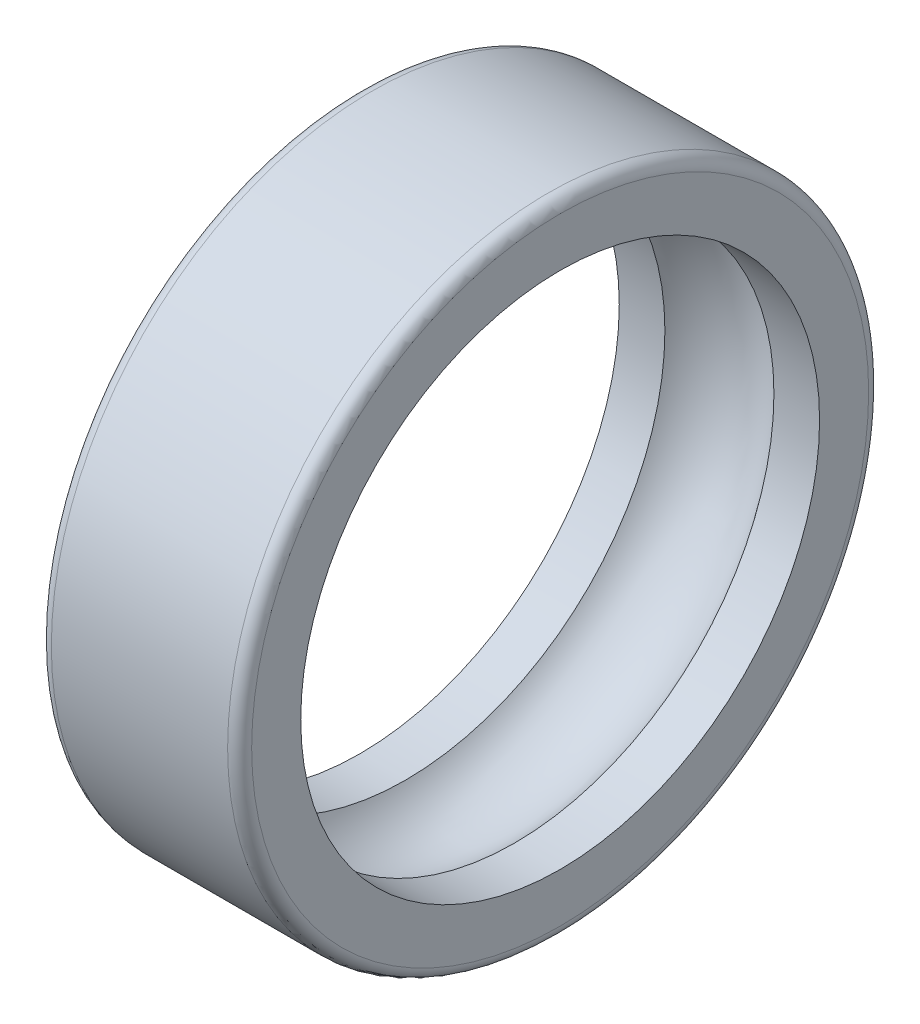
ISO-10303-21;
HEADER;
FILE_DESCRIPTION(('STEP AP214'),'2;1');
FILE_NAME('part.step','',(''),(''),'','','');
FILE_SCHEMA(('AUTOMOTIVE_DESIGN { 1 0 10303 214 1 1 1 1 }'));
ENDSEC;
DATA;
#1=APPLICATION_CONTEXT('core data for automotive mechanical design processes');
#2=APPLICATION_PROTOCOL_DEFINITION('international standard','automotive_design',2000,#1);
#3=PRODUCT_CONTEXT('',#1,'mechanical');
#4=PRODUCT('Part','Part','',(#3));
#5=PRODUCT_RELATED_PRODUCT_CATEGORY('part','',(#4));
#6=PRODUCT_DEFINITION_FORMATION('','',#4);
#7=PRODUCT_DEFINITION_CONTEXT('part definition',#1,'design');
#8=PRODUCT_DEFINITION('design','',#6,#7);
#9=PRODUCT_DEFINITION_SHAPE('','',#8);
#10=(LENGTH_UNIT() NAMED_UNIT(*) SI_UNIT(.MILLI.,.METRE.));
#11=(NAMED_UNIT(*) PLANE_ANGLE_UNIT() SI_UNIT($,.RADIAN.));
#12=(NAMED_UNIT(*) SI_UNIT($,.STERADIAN.) SOLID_ANGLE_UNIT());
#13=UNCERTAINTY_MEASURE_WITH_UNIT(LENGTH_MEASURE(1.E-05),#10,'distance_accuracy_value','');
#14=(GEOMETRIC_REPRESENTATION_CONTEXT(3) GLOBAL_UNCERTAINTY_ASSIGNED_CONTEXT((#13)) GLOBAL_UNIT_ASSIGNED_CONTEXT((#10,
#11,#12)) REPRESENTATION_CONTEXT('',''));
#15=CARTESIAN_POINT('',(0.,0.,0.));
#16=DIRECTION('',(0.,0.,1.));
#17=DIRECTION('',(1.,0.,0.));
#18=AXIS2_PLACEMENT_3D('',#15,#16,#17);
#19=CARTESIAN_POINT('',(0.,15.4,0.));
#20=DIRECTION('',(1.,0.,0.));
#21=DIRECTION('',(0.,0.,-1.));
#22=AXIS2_PLACEMENT_3D('',#19,#20,#21);
#23=PLANE('',#22);
#24=CARTESIAN_POINT('',(0.,0.,0.));
#25=DIRECTION('',(-1.,0.,0.));
#26=DIRECTION('',(0.,0.,1.));
#27=AXIS2_PLACEMENT_3D('',#24,#25,#26);
#28=CIRCLE('',#27,12.95);
#29=CARTESIAN_POINT('',(0.,0.,12.95));
#30=VERTEX_POINT('',#29);
#31=EDGE_CURVE('E10',#30,#30,#28,.T.);
#32=ORIENTED_EDGE('',*,*,#31,.F.);
#33=EDGE_LOOP('',(#32));
#34=FACE_BOUND('',#33,.T.);
#35=CARTESIAN_POINT('',(0.,0.,0.));
#36=DIRECTION('',(-1.,0.,0.));
#37=DIRECTION('',(0.,0.,1.));
#38=AXIS2_PLACEMENT_3D('',#35,#36,#37);
#39=CIRCLE('',#38,15.4);
#40=CARTESIAN_POINT('',(0.,0.,15.4));
#41=VERTEX_POINT('',#40);
#42=EDGE_CURVE('E58',#41,#41,#39,.T.);
#43=ORIENTED_EDGE('',*,*,#42,.T.);
#44=EDGE_LOOP('',(#43));
#45=FACE_BOUND('',#44,.T.);
#46=ADVANCED_FACE('F30',(#34,#45),#23,.F.);
#47=CARTESIAN_POINT('',(0.,0.,0.));
#48=DIRECTION('',(-1.,0.,0.));
#49=DIRECTION('',(0.,0.,1.));
#50=AXIS2_PLACEMENT_3D('',#47,#48,#49);
#51=CYLINDRICAL_SURFACE('',#50,12.95);
#52=CARTESIAN_POINT('',(2.27869771779923,0.,0.));
#53=DIRECTION('',(-1.,0.,0.));
#54=DIRECTION('',(0.,0.,1.));
#55=AXIS2_PLACEMENT_3D('',#52,#53,#54);
#56=CIRCLE('',#55,12.95);
#57=CARTESIAN_POINT('',(2.27869771779923,0.,12.95));
#58=VERTEX_POINT('',#57);
#59=EDGE_CURVE('E36',#58,#58,#56,.T.);
#60=ORIENTED_EDGE('',*,*,#59,.F.);
#61=EDGE_LOOP('',(#60));
#62=FACE_BOUND('',#61,.T.);
#63=ORIENTED_EDGE('',*,*,#31,.T.);
#64=EDGE_LOOP('',(#63));
#65=FACE_BOUND('',#64,.T.);
#66=ADVANCED_FACE('F95',(#62,#65),#51,.F.);
#67=CARTESIAN_POINT('',(5.,0.,0.));
#68=DIRECTION('',(-1.,0.,0.));
#69=DIRECTION('',(0.,0.,1.));
#70=AXIS2_PLACEMENT_3D('',#67,#68,#69);
#71=TOROIDAL_SURFACE('',#70,11.025,3.33333333333333);
#72=ORIENTED_EDGE('',*,*,#59,.T.);
#73=EDGE_LOOP('',(#72));
#74=FACE_BOUND('',#73,.T.);
#75=CARTESIAN_POINT('',(7.72130228220078,0.,0.));
#76=DIRECTION('',(-1.,0.,0.));
#77=DIRECTION('',(0.,0.,1.));
#78=AXIS2_PLACEMENT_3D('',#75,#76,#77);
#79=CIRCLE('',#78,12.95);
#80=CARTESIAN_POINT('',(7.72130228220078,0.,12.95));
#81=VERTEX_POINT('',#80);
#82=EDGE_CURVE('E40',#81,#81,#79,.T.);
#83=ORIENTED_EDGE('',*,*,#82,.F.);
#84=EDGE_LOOP('',(#83));
#85=FACE_BOUND('',#84,.T.);
#86=ADVANCED_FACE('F90',(#74,#85),#71,.F.);
#87=CARTESIAN_POINT('',(0.,0.,0.));
#88=DIRECTION('',(-1.,0.,0.));
#89=DIRECTION('',(0.,0.,1.));
#90=AXIS2_PLACEMENT_3D('',#87,#88,#89);
#91=CYLINDRICAL_SURFACE('',#90,12.95);
#92=CARTESIAN_POINT('',(9.99999999999999,0.,0.));
#93=DIRECTION('',(-1.,0.,0.));
#94=DIRECTION('',(0.,0.,1.));
#95=AXIS2_PLACEMENT_3D('',#92,#93,#94);
#96=CIRCLE('',#95,12.95);
#97=CARTESIAN_POINT('',(9.99999999999999,0.,12.95));
#98=VERTEX_POINT('',#97);
#99=EDGE_CURVE('E44',#98,#98,#96,.T.);
#100=ORIENTED_EDGE('',*,*,#99,.F.);
#101=EDGE_LOOP('',(#100));
#102=FACE_BOUND('',#101,.T.);
#103=ORIENTED_EDGE('',*,*,#82,.T.);
#104=EDGE_LOOP('',(#103));
#105=FACE_BOUND('',#104,.T.);
#106=ADVANCED_FACE('F84',(#102,#105),#91,.F.);
#107=CARTESIAN_POINT('',(10.,12.95,0.));
#108=DIRECTION('',(-1.,0.,0.));
#109=DIRECTION('',(0.,0.,1.));
#110=AXIS2_PLACEMENT_3D('',#107,#108,#109);
#111=PLANE('',#110);
#112=CARTESIAN_POINT('',(9.99999999999999,0.,0.));
#113=DIRECTION('',(-1.,0.,0.));
#114=DIRECTION('',(0.,0.,1.));
#115=AXIS2_PLACEMENT_3D('',#112,#113,#114);
#116=CIRCLE('',#115,15.4);
#117=CARTESIAN_POINT('',(9.99999999999999,0.,15.4));
#118=VERTEX_POINT('',#117);
#119=EDGE_CURVE('E49',#118,#118,#116,.T.);
#120=ORIENTED_EDGE('',*,*,#119,.F.);
#121=EDGE_LOOP('',(#120));
#122=FACE_BOUND('',#121,.T.);
#123=ORIENTED_EDGE('',*,*,#99,.T.);
#124=EDGE_LOOP('',(#123));
#125=FACE_BOUND('',#124,.T.);
#126=ADVANCED_FACE('F78',(#122,#125),#111,.F.);
#127=CARTESIAN_POINT('',(9.40000000000001,0.,0.));
#128=DIRECTION('',(-1.,0.,0.));
#129=DIRECTION('',(0.,0.,1.));
#130=AXIS2_PLACEMENT_3D('',#127,#128,#129);
#131=TOROIDAL_SURFACE('',#130,15.4,0.6);
#132=CARTESIAN_POINT('',(9.40000000000001,0.,0.));
#133=DIRECTION('',(-1.,0.,0.));
#134=DIRECTION('',(0.,0.,1.));
#135=AXIS2_PLACEMENT_3D('',#132,#133,#134);
#136=CIRCLE('',#135,16.);
#137=CARTESIAN_POINT('',(9.40000000000001,0.,16.));
#138=VERTEX_POINT('',#137);
#139=EDGE_CURVE('E52',#138,#138,#136,.T.);
#140=ORIENTED_EDGE('',*,*,#139,.F.);
#141=EDGE_LOOP('',(#140));
#142=FACE_BOUND('',#141,.T.);
#143=ORIENTED_EDGE('',*,*,#119,.T.);
#144=EDGE_LOOP('',(#143));
#145=FACE_BOUND('',#144,.T.);
#146=ADVANCED_FACE('F72',(#142,#145),#131,.T.);
#147=CARTESIAN_POINT('',(0.,0.,0.));
#148=DIRECTION('',(-1.,0.,0.));
#149=DIRECTION('',(0.,0.,1.));
#150=AXIS2_PLACEMENT_3D('',#147,#148,#149);
#151=CYLINDRICAL_SURFACE('',#150,16.);
#152=CARTESIAN_POINT('',(0.600000000000003,0.,0.));
#153=DIRECTION('',(-1.,0.,0.));
#154=DIRECTION('',(0.,0.,1.));
#155=AXIS2_PLACEMENT_3D('',#152,#153,#154);
#156=CIRCLE('',#155,16.);
#157=CARTESIAN_POINT('',(0.600000000000003,0.,16.));
#158=VERTEX_POINT('',#157);
#159=EDGE_CURVE('E55',#158,#158,#156,.T.);
#160=ORIENTED_EDGE('',*,*,#159,.F.);
#161=EDGE_LOOP('',(#160));
#162=FACE_BOUND('',#161,.T.);
#163=ORIENTED_EDGE('',*,*,#139,.T.);
#164=EDGE_LOOP('',(#163));
#165=FACE_BOUND('',#164,.T.);
#166=ADVANCED_FACE('F66',(#162,#165),#151,.T.);
#167=CARTESIAN_POINT('',(0.600000000000003,0.,0.));
#168=DIRECTION('',(-1.,0.,0.));
#169=DIRECTION('',(0.,0.,1.));
#170=AXIS2_PLACEMENT_3D('',#167,#168,#169);
#171=TOROIDAL_SURFACE('',#170,15.4,0.6);
#172=ORIENTED_EDGE('',*,*,#42,.F.);
#173=EDGE_LOOP('',(#172));
#174=FACE_BOUND('',#173,.T.);
#175=ORIENTED_EDGE('',*,*,#159,.T.);
#176=EDGE_LOOP('',(#175));
#177=FACE_BOUND('',#176,.T.);
#178=ADVANCED_FACE('F63',(#174,#177),#171,.T.);
#179=CLOSED_SHELL('',(#46,#66,#86,#106,#126,#146,#166,#178));
#180=MANIFOLD_SOLID_BREP('B2',#179);
#181=ADVANCED_BREP_SHAPE_REPRESENTATION('',(#18,#180),#14);
#182=SHAPE_DEFINITION_REPRESENTATION(#9,#181);
ENDSEC;
END-ISO-10303-21;
